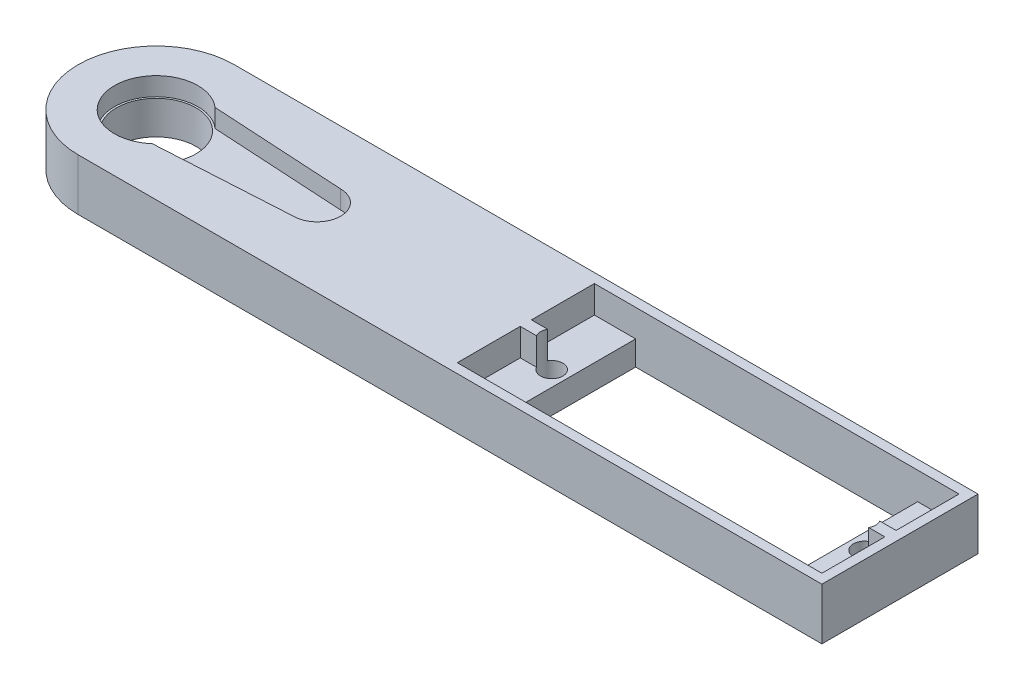
ISO-10303-21;
HEADER;
FILE_DESCRIPTION(('STEP AP214'),'2;1');
FILE_NAME('part.step','',(''),(''),'','','');
FILE_SCHEMA(('AUTOMOTIVE_DESIGN { 1 0 10303 214 1 1 1 1 }'));
ENDSEC;
DATA;
#1=APPLICATION_CONTEXT('core data for automotive mechanical design processes');
#2=APPLICATION_PROTOCOL_DEFINITION('international standard','automotive_design',2000,#1);
#3=PRODUCT_CONTEXT('',#1,'mechanical');
#4=PRODUCT('Part','Part','',(#3));
#5=PRODUCT_RELATED_PRODUCT_CATEGORY('part','',(#4));
#6=PRODUCT_DEFINITION_FORMATION('','',#4);
#7=PRODUCT_DEFINITION_CONTEXT('part definition',#1,'design');
#8=PRODUCT_DEFINITION('design','',#6,#7);
#9=PRODUCT_DEFINITION_SHAPE('','',#8);
#10=(LENGTH_UNIT() NAMED_UNIT(*) SI_UNIT(.MILLI.,.METRE.));
#11=(NAMED_UNIT(*) PLANE_ANGLE_UNIT() SI_UNIT($,.RADIAN.));
#12=(NAMED_UNIT(*) SI_UNIT($,.STERADIAN.) SOLID_ANGLE_UNIT());
#13=UNCERTAINTY_MEASURE_WITH_UNIT(LENGTH_MEASURE(1.E-05),#10,'distance_accuracy_value','');
#14=(GEOMETRIC_REPRESENTATION_CONTEXT(3) GLOBAL_UNCERTAINTY_ASSIGNED_CONTEXT((#13)) GLOBAL_UNIT_ASSIGNED_CONTEXT((#10,
#11,#12)) REPRESENTATION_CONTEXT('',''));
#15=CARTESIAN_POINT('',(0.,0.,0.));
#16=DIRECTION('',(0.,0.,1.));
#17=DIRECTION('',(1.,0.,0.));
#18=AXIS2_PLACEMENT_3D('',#15,#16,#17);
#19=CARTESIAN_POINT('',(36.85,0.,0.));
#20=DIRECTION('',(1.,0.,0.));
#21=DIRECTION('',(0.,0.,-1.));
#22=AXIS2_PLACEMENT_3D('',#19,#20,#21);
#23=PLANE('',#22);
#24=DIRECTION('',(0.,1.,0.));
#25=VECTOR('',#24,1.);
#26=CARTESIAN_POINT('',(36.85,0.,-6.15));
#27=LINE('',#26,#25);
#28=CARTESIAN_POINT('',(36.85,0.,-6.15));
#29=VERTEX_POINT('',#28);
#30=CARTESIAN_POINT('',(36.85,2.19,-6.15));
#31=VERTEX_POINT('',#30);
#32=EDGE_CURVE('E209',#29,#31,#27,.T.);
#33=ORIENTED_EDGE('',*,*,#32,.T.);
#34=DIRECTION('',(0.,0.,-1.));
#35=VECTOR('',#34,1.);
#36=CARTESIAN_POINT('',(36.85,2.19,6.15));
#37=LINE('',#36,#35);
#38=CARTESIAN_POINT('',(36.85,2.19,6.15));
#39=VERTEX_POINT('',#38);
#40=EDGE_CURVE('E217',#39,#31,#37,.T.);
#41=ORIENTED_EDGE('',*,*,#40,.F.);
#42=DIRECTION('',(0.,-1.,0.));
#43=VECTOR('',#42,1.);
#44=CARTESIAN_POINT('',(36.85,3.19,6.15));
#45=LINE('',#44,#43);
#46=CARTESIAN_POINT('',(36.85,0.,6.15));
#47=VERTEX_POINT('',#46);
#48=EDGE_CURVE('E227',#39,#47,#45,.T.);
#49=ORIENTED_EDGE('',*,*,#48,.T.);
#50=DIRECTION('',(0.,0.,-1.));
#51=VECTOR('',#50,1.);
#52=CARTESIAN_POINT('',(36.85,0.,6.15));
#53=LINE('',#52,#51);
#54=EDGE_CURVE('E225',#47,#29,#53,.T.);
#55=ORIENTED_EDGE('',*,*,#54,.T.);
#56=EDGE_LOOP('',(#33,#41,#49,#55));
#57=FACE_BOUND('',#56,.T.);
#58=ADVANCED_FACE('F40',(#57),#23,.T.);
#59=CARTESIAN_POINT('',(62.1396314901945,0.,0.));
#60=DIRECTION('',(-1.,0.,0.));
#61=DIRECTION('',(0.,0.,1.));
#62=AXIS2_PLACEMENT_3D('',#59,#60,#61);
#63=PLANE('',#62);
#64=DIRECTION('',(0.,1.,0.));
#65=VECTOR('',#64,1.);
#66=CARTESIAN_POINT('',(62.1396314901945,0.,6.15));
#67=LINE('',#66,#65);
#68=CARTESIAN_POINT('',(62.1396314901945,0.,6.15));
#69=VERTEX_POINT('',#68);
#70=CARTESIAN_POINT('',(62.1396314901945,2.19,6.15));
#71=VERTEX_POINT('',#70);
#72=EDGE_CURVE('E233',#69,#71,#67,.T.);
#73=ORIENTED_EDGE('',*,*,#72,.T.);
#74=DIRECTION('',(0.,0.,1.));
#75=VECTOR('',#74,1.);
#76=CARTESIAN_POINT('',(62.1396314901945,2.19,-6.15));
#77=LINE('',#76,#75);
#78=CARTESIAN_POINT('',(62.1396314901945,2.19,-6.15));
#79=VERTEX_POINT('',#78);
#80=EDGE_CURVE('E455',#79,#71,#77,.T.);
#81=ORIENTED_EDGE('',*,*,#80,.F.);
#82=DIRECTION('',(0.,-1.,0.));
#83=VECTOR('',#82,1.);
#84=CARTESIAN_POINT('',(62.1396314901945,3.19,-6.15));
#85=LINE('',#84,#83);
#86=CARTESIAN_POINT('',(62.1396314901945,0.,-6.15));
#87=VERTEX_POINT('',#86);
#88=EDGE_CURVE('E228',#79,#87,#85,.T.);
#89=ORIENTED_EDGE('',*,*,#88,.T.);
#90=DIRECTION('',(0.,0.,1.));
#91=VECTOR('',#90,1.);
#92=CARTESIAN_POINT('',(62.1396314901945,0.,-6.15));
#93=LINE('',#92,#91);
#94=EDGE_CURVE('E481',#87,#69,#93,.T.);
#95=ORIENTED_EDGE('',*,*,#94,.T.);
#96=EDGE_LOOP('',(#73,#81,#89,#95));
#97=FACE_BOUND('',#96,.T.);
#98=ADVANCED_FACE('F488',(#97),#63,.T.);
#99=CARTESIAN_POINT('',(0.,4.64,0.));
#100=DIRECTION('',(0.,1.,0.));
#101=DIRECTION('',(0.,0.,1.));
#102=AXIS2_PLACEMENT_3D('',#99,#100,#101);
#103=PLANE('',#102);
#104=DIRECTION('',(0.,0.,-1.));
#105=VECTOR('',#104,1.);
#106=CARTESIAN_POINT('',(65.85,4.64,6.15));
#107=LINE('',#106,#105);
#108=CARTESIAN_POINT('',(65.85,4.64,6.15));
#109=VERTEX_POINT('',#108);
#110=CARTESIAN_POINT('',(65.85,4.64,0.5));
#111=VERTEX_POINT('',#110);
#112=EDGE_CURVE('E240',#109,#111,#107,.T.);
#113=ORIENTED_EDGE('',*,*,#112,.F.);
#114=DIRECTION('',(-1.,0.,0.));
#115=VECTOR('',#114,1.);
#116=CARTESIAN_POINT('',(37.85,4.64,6.15));
#117=LINE('',#116,#115);
#118=CARTESIAN_POINT('',(33.15,4.64,6.15));
#119=VERTEX_POINT('',#118);
#120=EDGE_CURVE('E288',#109,#119,#117,.T.);
#121=ORIENTED_EDGE('',*,*,#120,.T.);
#122=DIRECTION('',(0.,0.,-1.));
#123=VECTOR('',#122,1.);
#124=CARTESIAN_POINT('',(33.15,4.64,6.15));
#125=LINE('',#124,#123);
#126=CARTESIAN_POINT('',(33.15,4.64,0.5));
#127=VERTEX_POINT('',#126);
#128=EDGE_CURVE('E264',#119,#127,#125,.T.);
#129=ORIENTED_EDGE('',*,*,#128,.T.);
#130=DIRECTION('',(-1.,0.,0.));
#131=VECTOR('',#130,1.);
#132=CARTESIAN_POINT('',(0.,4.64,0.500000000000009));
#133=LINE('',#132,#131);
#134=CARTESIAN_POINT('',(34.6056199658342,4.64,0.5));
#135=VERTEX_POINT('',#134);
#136=EDGE_CURVE('E49',#135,#127,#133,.T.);
#137=ORIENTED_EDGE('',*,*,#136,.F.);
#138=CARTESIAN_POINT('',(35.4716453696186,4.64,0.));
#139=DIRECTION('',(0.,1.,0.));
#140=DIRECTION('',(0.,0.,1.));
#141=AXIS2_PLACEMENT_3D('',#138,#139,#140);
#142=CIRCLE('',#141,1.00000000000001);
#143=CARTESIAN_POINT('',(34.6056199658342,4.64,-0.5));
#144=VERTEX_POINT('',#143);
#145=EDGE_CURVE('E297',#144,#135,#142,.T.);
#146=ORIENTED_EDGE('',*,*,#145,.F.);
#147=DIRECTION('',(-1.,0.,0.));
#148=VECTOR('',#147,1.);
#149=CARTESIAN_POINT('',(0.,4.64,-0.500000000000008));
#150=LINE('',#149,#148);
#151=CARTESIAN_POINT('',(33.15,4.64,-0.5));
#152=VERTEX_POINT('',#151);
#153=EDGE_CURVE('E345',#144,#152,#150,.T.);
#154=ORIENTED_EDGE('',*,*,#153,.T.);
#155=DIRECTION('',(0.,0.,-1.));
#156=VECTOR('',#155,1.);
#157=CARTESIAN_POINT('',(33.15,4.64,-0.5));
#158=LINE('',#157,#156);
#159=CARTESIAN_POINT('',(33.15,4.64,-6.15));
#160=VERTEX_POINT('',#159);
#161=EDGE_CURVE('E250',#152,#160,#158,.T.);
#162=ORIENTED_EDGE('',*,*,#161,.T.);
#163=DIRECTION('',(1.,0.,0.));
#164=VECTOR('',#163,1.);
#165=CARTESIAN_POINT('',(37.85,4.64,-6.15));
#166=LINE('',#165,#164);
#167=CARTESIAN_POINT('',(65.85,4.64,-6.15));
#168=VERTEX_POINT('',#167);
#169=EDGE_CURVE('E273',#160,#168,#166,.T.);
#170=ORIENTED_EDGE('',*,*,#169,.T.);
#171=DIRECTION('',(0.,0.,-1.));
#172=VECTOR('',#171,1.);
#173=CARTESIAN_POINT('',(65.85,4.64,-6.15));
#174=LINE('',#173,#172);
#175=CARTESIAN_POINT('',(65.85,4.64,-0.5));
#176=VERTEX_POINT('',#175);
#177=EDGE_CURVE('E239',#176,#168,#174,.T.);
#178=ORIENTED_EDGE('',*,*,#177,.F.);
#179=DIRECTION('',(-1.,0.,0.));
#180=VECTOR('',#179,1.);
#181=CARTESIAN_POINT('',(0.,4.64,-0.499999999999984));
#182=LINE('',#181,#180);
#183=CARTESIAN_POINT('',(64.3943800341658,4.64,-0.5));
#184=VERTEX_POINT('',#183);
#185=EDGE_CURVE('E312',#176,#184,#182,.T.);
#186=ORIENTED_EDGE('',*,*,#185,.T.);
#187=CARTESIAN_POINT('',(63.5283546303813,4.64,0.));
#188=DIRECTION('',(0.,1.,0.));
#189=DIRECTION('',(0.,0.,1.));
#190=AXIS2_PLACEMENT_3D('',#187,#188,#189);
#191=CIRCLE('',#190,1.00000000000001);
#192=CARTESIAN_POINT('',(64.3943800341658,4.64,0.5));
#193=VERTEX_POINT('',#192);
#194=EDGE_CURVE('E298',#193,#184,#191,.T.);
#195=ORIENTED_EDGE('',*,*,#194,.F.);
#196=DIRECTION('',(1.,0.,0.));
#197=VECTOR('',#196,1.);
#198=CARTESIAN_POINT('',(0.,4.64,0.499999999999984));
#199=LINE('',#198,#197);
#200=EDGE_CURVE('E317',#193,#111,#199,.T.);
#201=ORIENTED_EDGE('',*,*,#200,.T.);
#202=EDGE_LOOP('',(#113,#121,#129,#137,#146,#154,#162,#170,#178,#186,#195,#201));
#203=FACE_BOUND('',#202,.T.);
#204=DIRECTION('',(1.,0.,0.));
#205=VECTOR('',#204,1.);
#206=CARTESIAN_POINT('',(0.,4.64,7.));
#207=LINE('',#206,#205);
#208=CARTESIAN_POINT('',(0.,4.64,7.));
#209=VERTEX_POINT('',#208);
#210=CARTESIAN_POINT('',(66.7,4.64,7.));
#211=VERTEX_POINT('',#210);
#212=EDGE_CURVE('E379',#209,#211,#207,.T.);
#213=ORIENTED_EDGE('',*,*,#212,.T.);
#214=DIRECTION('',(0.,0.,-1.));
#215=VECTOR('',#214,1.);
#216=CARTESIAN_POINT('',(66.7,4.64,0.));
#217=LINE('',#216,#215);
#218=CARTESIAN_POINT('',(66.7,4.64,-7.));
#219=VERTEX_POINT('',#218);
#220=EDGE_CURVE('E320',#211,#219,#217,.T.);
#221=ORIENTED_EDGE('',*,*,#220,.T.);
#222=DIRECTION('',(-1.,0.,0.));
#223=VECTOR('',#222,1.);
#224=CARTESIAN_POINT('',(55.,4.64,-7.));
#225=LINE('',#224,#223);
#226=CARTESIAN_POINT('',(0.,4.64,-7.));
#227=VERTEX_POINT('',#226);
#228=EDGE_CURVE('E348',#219,#227,#225,.T.);
#229=ORIENTED_EDGE('',*,*,#228,.T.);
#230=CARTESIAN_POINT('',(0.,4.64,0.));
#231=DIRECTION('',(0.,1.,0.));
#232=DIRECTION('',(0.,0.,1.));
#233=AXIS2_PLACEMENT_3D('',#230,#231,#232);
#234=CIRCLE('',#233,7.);
#235=EDGE_CURVE('E378',#227,#209,#234,.T.);
#236=ORIENTED_EDGE('',*,*,#235,.T.);
#237=EDGE_LOOP('',(#213,#221,#229,#236));
#238=FACE_BOUND('',#237,.T.);
#239=DIRECTION('',(-0.998310081629833,0.,-0.0581117967045882));
#240=VECTOR('',#239,1.);
#241=CARTESIAN_POINT('',(14.4300468804628,4.64,-2.1199939926796));
#242=LINE('',#241,#240);
#243=CARTESIAN_POINT('',(14.4300468804628,4.64,-2.1199939926796));
#244=VERTEX_POINT('',#243);
#245=CARTESIAN_POINT('',(2.46852452254572,4.64,-2.81627620832731));
#246=VERTEX_POINT('',#245);
#247=EDGE_CURVE('E390',#244,#246,#242,.T.);
#248=ORIENTED_EDGE('',*,*,#247,.F.);
#249=CARTESIAN_POINT('',(14.425,4.64,0.));
#250=DIRECTION('',(0.,1.,0.));
#251=DIRECTION('',(0.,0.,1.));
#252=AXIS2_PLACEMENT_3D('',#249,#250,#251);
#253=CIRCLE('',#252,2.12);
#254=CARTESIAN_POINT('',(14.4300468804629,4.64,2.1199939926796));
#255=VERTEX_POINT('',#254);
#256=EDGE_CURVE('E382',#255,#244,#253,.T.);
#257=ORIENTED_EDGE('',*,*,#256,.F.);
#258=DIRECTION('',(0.998310081629833,0.,-0.0581117967045877));
#259=VECTOR('',#258,1.);
#260=CARTESIAN_POINT('',(2.46852452254572,4.64,2.81627620832731));
#261=LINE('',#260,#259);
#262=CARTESIAN_POINT('',(2.46852452254572,4.64,2.81627620832731));
#263=VERTEX_POINT('',#262);
#264=EDGE_CURVE('E398',#263,#255,#261,.T.);
#265=ORIENTED_EDGE('',*,*,#264,.F.);
#266=CARTESIAN_POINT('',(0.,4.64,0.));
#267=DIRECTION('',(0.,1.,0.));
#268=DIRECTION('',(0.,0.,-1.));
#269=AXIS2_PLACEMENT_3D('',#266,#267,#268);
#270=CIRCLE('',#269,3.745);
#271=EDGE_CURVE('E394',#246,#263,#270,.T.);
#272=ORIENTED_EDGE('',*,*,#271,.F.);
#273=EDGE_LOOP('',(#248,#257,#265,#272));
#274=FACE_BOUND('',#273,.T.);
#275=ADVANCED_FACE('F513',(#203,#238,#274),#103,.T.);
#276=CARTESIAN_POINT('',(0.,3.,0.));
#277=DIRECTION('',(0.,1.,0.));
#278=DIRECTION('',(0.,0.,1.));
#279=AXIS2_PLACEMENT_3D('',#276,#277,#278);
#280=PLANE('',#279);
#281=CARTESIAN_POINT('',(0.,3.,0.));
#282=DIRECTION('',(0.,1.,0.));
#283=DIRECTION('',(0.,0.,1.));
#284=AXIS2_PLACEMENT_3D('',#281,#282,#283);
#285=CIRCLE('',#284,3.575);
#286=CARTESIAN_POINT('',(0.,3.,3.575));
#287=VERTEX_POINT('',#286);
#288=EDGE_CURVE('E363',#287,#287,#285,.T.);
#289=ORIENTED_EDGE('',*,*,#288,.F.);
#290=EDGE_LOOP('',(#289));
#291=FACE_BOUND('',#290,.T.);
#292=DIRECTION('',(0.998310081629833,0.,-0.0581117967045877));
#293=VECTOR('',#292,1.);
#294=CARTESIAN_POINT('',(2.46852452254572,3.,2.81627620832731));
#295=LINE('',#294,#293);
#296=CARTESIAN_POINT('',(2.46852452254572,3.,2.81627620832731));
#297=VERTEX_POINT('',#296);
#298=CARTESIAN_POINT('',(14.4300468804629,3.,2.1199939926796));
#299=VERTEX_POINT('',#298);
#300=EDGE_CURVE('E330',#297,#299,#295,.T.);
#301=ORIENTED_EDGE('',*,*,#300,.T.);
#302=CARTESIAN_POINT('',(14.425,3.,0.));
#303=DIRECTION('',(0.,1.,0.));
#304=DIRECTION('',(0.,0.,1.));
#305=AXIS2_PLACEMENT_3D('',#302,#303,#304);
#306=CIRCLE('',#305,2.12);
#307=CARTESIAN_POINT('',(14.4300468804628,3.,-2.1199939926796));
#308=VERTEX_POINT('',#307);
#309=EDGE_CURVE('E405',#299,#308,#306,.T.);
#310=ORIENTED_EDGE('',*,*,#309,.T.);
#311=DIRECTION('',(-0.998310081629833,0.,-0.0581117967045882));
#312=VECTOR('',#311,1.);
#313=CARTESIAN_POINT('',(14.4300468804628,3.,-2.1199939926796));
#314=LINE('',#313,#312);
#315=CARTESIAN_POINT('',(2.46852452254572,3.,-2.81627620832731));
#316=VERTEX_POINT('',#315);
#317=EDGE_CURVE('E409',#308,#316,#314,.T.);
#318=ORIENTED_EDGE('',*,*,#317,.T.);
#319=CARTESIAN_POINT('',(0.,3.,0.));
#320=DIRECTION('',(0.,1.,0.));
#321=DIRECTION('',(0.,0.,-1.));
#322=AXIS2_PLACEMENT_3D('',#319,#320,#321);
#323=CIRCLE('',#322,3.745);
#324=EDGE_CURVE('E369',#316,#297,#323,.T.);
#325=ORIENTED_EDGE('',*,*,#324,.T.);
#326=EDGE_LOOP('',(#301,#310,#318,#325));
#327=FACE_BOUND('',#326,.T.);
#328=ADVANCED_FACE('F553',(#291,#327),#280,.T.);
#329=CARTESIAN_POINT('',(0.,3.,0.));
#330=DIRECTION('',(0.,-1.,0.));
#331=DIRECTION('',(0.,0.,-1.));
#332=AXIS2_PLACEMENT_3D('',#329,#330,#331);
#333=CYLINDRICAL_SURFACE('',#332,7.);
#334=CARTESIAN_POINT('',(0.,0.,0.));
#335=DIRECTION('',(0.,1.,0.));
#336=DIRECTION('',(0.,0.,1.));
#337=AXIS2_PLACEMENT_3D('',#334,#335,#336);
#338=CIRCLE('',#337,7.);
#339=CARTESIAN_POINT('',(0.,0.,-7.));
#340=VERTEX_POINT('',#339);
#341=CARTESIAN_POINT('',(0.,0.,7.));
#342=VERTEX_POINT('',#341);
#343=EDGE_CURVE('E360',#340,#342,#338,.T.);
#344=ORIENTED_EDGE('',*,*,#343,.T.);
#345=DIRECTION('',(0.,-1.,0.));
#346=VECTOR('',#345,1.);
#347=CARTESIAN_POINT('',(0.,3.,7.));
#348=LINE('',#347,#346);
#349=EDGE_CURVE('E350',#209,#342,#348,.T.);
#350=ORIENTED_EDGE('',*,*,#349,.F.);
#351=ORIENTED_EDGE('',*,*,#235,.F.);
#352=DIRECTION('',(0.,-1.,0.));
#353=VECTOR('',#352,1.);
#354=CARTESIAN_POINT('',(0.,3.,-7.));
#355=LINE('',#354,#353);
#356=EDGE_CURVE('E356',#227,#340,#355,.T.);
#357=ORIENTED_EDGE('',*,*,#356,.T.);
#358=EDGE_LOOP('',(#344,#350,#351,#357));
#359=FACE_BOUND('',#358,.T.);
#360=ADVANCED_FACE('F549',(#359),#333,.T.);
#361=CARTESIAN_POINT('',(0.,3.,7.));
#362=DIRECTION('',(0.,0.,-1.));
#363=DIRECTION('',(-1.,0.,0.));
#364=AXIS2_PLACEMENT_3D('',#361,#362,#363);
#365=PLANE('',#364);
#366=DIRECTION('',(1.,0.,0.));
#367=VECTOR('',#366,1.);
#368=CARTESIAN_POINT('',(0.,0.,7.));
#369=LINE('',#368,#367);
#370=CARTESIAN_POINT('',(66.7,0.,7.));
#371=VERTEX_POINT('',#370);
#372=EDGE_CURVE('E355',#342,#371,#369,.T.);
#373=ORIENTED_EDGE('',*,*,#372,.T.);
#374=DIRECTION('',(0.,1.,0.));
#375=VECTOR('',#374,1.);
#376=CARTESIAN_POINT('',(66.7,-36.2154663092994,7.));
#377=LINE('',#376,#375);
#378=EDGE_CURVE('E331',#371,#211,#377,.T.);
#379=ORIENTED_EDGE('',*,*,#378,.T.);
#380=ORIENTED_EDGE('',*,*,#212,.F.);
#381=ORIENTED_EDGE('',*,*,#349,.T.);
#382=EDGE_LOOP('',(#373,#379,#380,#381));
#383=FACE_BOUND('',#382,.T.);
#384=ADVANCED_FACE('F552',(#383),#365,.F.);
#385=CARTESIAN_POINT('',(0.,3.,-7.));
#386=DIRECTION('',(0.,0.,1.));
#387=DIRECTION('',(1.,0.,0.));
#388=AXIS2_PLACEMENT_3D('',#385,#386,#387);
#389=PLANE('',#388);
#390=ORIENTED_EDGE('',*,*,#356,.F.);
#391=ORIENTED_EDGE('',*,*,#228,.F.);
#392=DIRECTION('',(0.,1.,0.));
#393=VECTOR('',#392,1.);
#394=CARTESIAN_POINT('',(66.7,-36.2154663092994,-7.));
#395=LINE('',#394,#393);
#396=CARTESIAN_POINT('',(66.7,0.,-7.));
#397=VERTEX_POINT('',#396);
#398=EDGE_CURVE('E335',#397,#219,#395,.T.);
#399=ORIENTED_EDGE('',*,*,#398,.F.);
#400=DIRECTION('',(-1.,0.,0.));
#401=VECTOR('',#400,1.);
#402=CARTESIAN_POINT('',(0.,0.,-7.));
#403=LINE('',#402,#401);
#404=EDGE_CURVE('E354',#397,#340,#403,.T.);
#405=ORIENTED_EDGE('',*,*,#404,.T.);
#406=EDGE_LOOP('',(#390,#391,#399,#405));
#407=FACE_BOUND('',#406,.T.);
#408=ADVANCED_FACE('F557',(#407),#389,.F.);
#409=CARTESIAN_POINT('',(0.,0.,0.));
#410=DIRECTION('',(0.,1.,0.));
#411=DIRECTION('',(0.,0.,1.));
#412=AXIS2_PLACEMENT_3D('',#409,#410,#411);
#413=PLANE('',#412);
#414=ORIENTED_EDGE('',*,*,#94,.F.);
#415=DIRECTION('',(-1.,0.,0.));
#416=VECTOR('',#415,1.);
#417=CARTESIAN_POINT('',(0.,0.,-6.15));
#418=LINE('',#417,#416);
#419=EDGE_CURVE('E294',#87,#29,#418,.T.);
#420=ORIENTED_EDGE('',*,*,#419,.T.);
#421=ORIENTED_EDGE('',*,*,#54,.F.);
#422=DIRECTION('',(1.,0.,0.));
#423=VECTOR('',#422,1.);
#424=CARTESIAN_POINT('',(0.,0.,6.15));
#425=LINE('',#424,#423);
#426=EDGE_CURVE('E291',#47,#69,#425,.T.);
#427=ORIENTED_EDGE('',*,*,#426,.T.);
#428=EDGE_LOOP('',(#414,#420,#421,#427));
#429=FACE_BOUND('',#428,.T.);
#430=CARTESIAN_POINT('',(63.5283546303813,0.,0.));
#431=DIRECTION('',(0.,1.,0.));
#432=DIRECTION('',(0.,0.,1.));
#433=AXIS2_PLACEMENT_3D('',#430,#431,#432);
#434=CIRCLE('',#433,1.00000000000001);
#435=CARTESIAN_POINT('',(63.5283546303813,0.,1.00000000000001));
#436=VERTEX_POINT('',#435);
#437=EDGE_CURVE('E301',#436,#436,#434,.F.);
#438=ORIENTED_EDGE('',*,*,#437,.F.);
#439=EDGE_LOOP('',(#438));
#440=FACE_BOUND('',#439,.T.);
#441=CARTESIAN_POINT('',(35.4716453696186,0.,0.));
#442=DIRECTION('',(0.,1.,0.));
#443=DIRECTION('',(0.,0.,1.));
#444=AXIS2_PLACEMENT_3D('',#441,#442,#443);
#445=CIRCLE('',#444,1.00000000000001);
#446=CARTESIAN_POINT('',(35.4716453696186,0.,1.00000000000001));
#447=VERTEX_POINT('',#446);
#448=EDGE_CURVE('E302',#447,#447,#445,.F.);
#449=ORIENTED_EDGE('',*,*,#448,.F.);
#450=EDGE_LOOP('',(#449));
#451=FACE_BOUND('',#450,.T.);
#452=DIRECTION('',(0.,0.,1.));
#453=VECTOR('',#452,1.);
#454=CARTESIAN_POINT('',(66.7,0.,0.));
#455=LINE('',#454,#453);
#456=EDGE_CURVE('E326',#397,#371,#455,.T.);
#457=ORIENTED_EDGE('',*,*,#456,.T.);
#458=ORIENTED_EDGE('',*,*,#372,.F.);
#459=ORIENTED_EDGE('',*,*,#343,.F.);
#460=ORIENTED_EDGE('',*,*,#404,.F.);
#461=EDGE_LOOP('',(#457,#458,#459,#460));
#462=FACE_BOUND('',#461,.T.);
#463=CARTESIAN_POINT('',(0.,0.,0.));
#464=DIRECTION('',(0.,-1.,0.));
#465=DIRECTION('',(0.,0.,-1.));
#466=AXIS2_PLACEMENT_3D('',#463,#464,#465);
#467=CIRCLE('',#466,3.575);
#468=CARTESIAN_POINT('',(0.,0.,-3.575));
#469=VERTEX_POINT('',#468);
#470=EDGE_CURVE('E349',#469,#469,#467,.T.);
#471=ORIENTED_EDGE('',*,*,#470,.F.);
#472=EDGE_LOOP('',(#471));
#473=FACE_BOUND('',#472,.T.);
#474=ADVANCED_FACE('F42',(#429,#440,#451,#462,#473),#413,.F.);
#475=CARTESIAN_POINT('',(0.,3.95,0.));
#476=DIRECTION('',(0.,-1.,0.));
#477=DIRECTION('',(0.,0.,-1.));
#478=AXIS2_PLACEMENT_3D('',#475,#476,#477);
#479=CYLINDRICAL_SURFACE('',#478,3.575);
#480=ORIENTED_EDGE('',*,*,#288,.T.);
#481=EDGE_LOOP('',(#480));
#482=FACE_BOUND('',#481,.T.);
#483=ORIENTED_EDGE('',*,*,#470,.T.);
#484=EDGE_LOOP('',(#483));
#485=FACE_BOUND('',#484,.T.);
#486=ADVANCED_FACE('F565',(#482,#485),#479,.F.);
#487=CARTESIAN_POINT('',(14.425,4.64,0.));
#488=DIRECTION('',(0.,-1.,0.));
#489=DIRECTION('',(0.,0.,-1.));
#490=AXIS2_PLACEMENT_3D('',#487,#488,#489);
#491=CYLINDRICAL_SURFACE('',#490,2.12);
#492=ORIENTED_EDGE('',*,*,#309,.F.);
#493=DIRECTION('',(0.,-1.,0.));
#494=VECTOR('',#493,1.);
#495=CARTESIAN_POINT('',(14.4300468804629,4.64,2.1199939926796));
#496=LINE('',#495,#494);
#497=EDGE_CURVE('E399',#255,#299,#496,.T.);
#498=ORIENTED_EDGE('',*,*,#497,.F.);
#499=ORIENTED_EDGE('',*,*,#256,.T.);
#500=DIRECTION('',(0.,-1.,0.));
#501=VECTOR('',#500,1.);
#502=CARTESIAN_POINT('',(14.4300468804628,4.64,-2.1199939926796));
#503=LINE('',#502,#501);
#504=EDGE_CURVE('E386',#244,#308,#503,.T.);
#505=ORIENTED_EDGE('',*,*,#504,.T.);
#506=EDGE_LOOP('',(#492,#498,#499,#505));
#507=FACE_BOUND('',#506,.T.);
#508=ADVANCED_FACE('F568',(#507),#491,.F.);
#509=CARTESIAN_POINT('',(14.4300468804628,4.64,-2.1199939926796));
#510=DIRECTION('',(-0.0581117967045882,0.,0.998310081629833));
#511=DIRECTION('',(0.998310081629833,0.,0.0581117967045882));
#512=AXIS2_PLACEMENT_3D('',#509,#510,#511);
#513=PLANE('',#512);
#514=ORIENTED_EDGE('',*,*,#317,.F.);
#515=ORIENTED_EDGE('',*,*,#504,.F.);
#516=ORIENTED_EDGE('',*,*,#247,.T.);
#517=DIRECTION('',(0.,-1.,0.));
#518=VECTOR('',#517,1.);
#519=CARTESIAN_POINT('',(2.46852452254572,4.64,-2.81627620832731));
#520=LINE('',#519,#518);
#521=EDGE_CURVE('E391',#246,#316,#520,.T.);
#522=ORIENTED_EDGE('',*,*,#521,.T.);
#523=EDGE_LOOP('',(#514,#515,#516,#522));
#524=FACE_BOUND('',#523,.T.);
#525=ADVANCED_FACE('F575',(#524),#513,.T.);
#526=CARTESIAN_POINT('',(0.,4.64,0.));
#527=DIRECTION('',(0.,-1.,0.));
#528=DIRECTION('',(0.,0.,-1.));
#529=AXIS2_PLACEMENT_3D('',#526,#527,#528);
#530=CYLINDRICAL_SURFACE('',#529,3.745);
#531=ORIENTED_EDGE('',*,*,#324,.F.);
#532=ORIENTED_EDGE('',*,*,#521,.F.);
#533=ORIENTED_EDGE('',*,*,#271,.T.);
#534=DIRECTION('',(0.,-1.,0.));
#535=VECTOR('',#534,1.);
#536=CARTESIAN_POINT('',(2.46852452254572,4.64,2.81627620832731));
#537=LINE('',#536,#535);
#538=EDGE_CURVE('E395',#263,#297,#537,.T.);
#539=ORIENTED_EDGE('',*,*,#538,.T.);
#540=EDGE_LOOP('',(#531,#532,#533,#539));
#541=FACE_BOUND('',#540,.T.);
#542=ADVANCED_FACE('F579',(#541),#530,.F.);
#543=CARTESIAN_POINT('',(2.46852452254572,4.64,2.81627620832731));
#544=DIRECTION('',(-0.0581117967045877,0.,-0.998310081629833));
#545=DIRECTION('',(-0.998310081629834,0.,0.0581117967045878));
#546=AXIS2_PLACEMENT_3D('',#543,#544,#545);
#547=PLANE('',#546);
#548=ORIENTED_EDGE('',*,*,#300,.F.);
#549=ORIENTED_EDGE('',*,*,#538,.F.);
#550=ORIENTED_EDGE('',*,*,#264,.T.);
#551=ORIENTED_EDGE('',*,*,#497,.T.);
#552=EDGE_LOOP('',(#548,#549,#550,#551));
#553=FACE_BOUND('',#552,.T.);
#554=ADVANCED_FACE('F583',(#553),#547,.T.);
#555=CARTESIAN_POINT('',(49.5,5.59,-0.499999999999996));
#556=DIRECTION('',(0.,0.,-1.));
#557=DIRECTION('',(1.,0.,0.));
#558=AXIS2_PLACEMENT_3D('',#555,#556,#557);
#559=PLANE('',#558);
#560=DIRECTION('',(0.,-1.,0.));
#561=VECTOR('',#560,1.);
#562=CARTESIAN_POINT('',(34.6056199658342,5.59,-0.5));
#563=LINE('',#562,#561);
#564=CARTESIAN_POINT('',(34.6056199658342,2.19,-0.500000000000001));
#565=VERTEX_POINT('',#564);
#566=EDGE_CURVE('E344',#144,#565,#563,.T.);
#567=ORIENTED_EDGE('',*,*,#566,.T.);
#568=DIRECTION('',(1.,0.,0.));
#569=VECTOR('',#568,1.);
#570=CARTESIAN_POINT('',(33.15,2.19,-0.5));
#571=LINE('',#570,#569);
#572=CARTESIAN_POINT('',(33.15,2.19,-0.5));
#573=VERTEX_POINT('',#572);
#574=EDGE_CURVE('E430',#573,#565,#571,.T.);
#575=ORIENTED_EDGE('',*,*,#574,.F.);
#576=DIRECTION('',(0.,1.,0.));
#577=VECTOR('',#576,1.);
#578=CARTESIAN_POINT('',(33.15,-4.15931969640728,-0.5));
#579=LINE('',#578,#577);
#580=EDGE_CURVE('E279',#573,#152,#579,.T.);
#581=ORIENTED_EDGE('',*,*,#580,.T.);
#582=ORIENTED_EDGE('',*,*,#153,.F.);
#583=EDGE_LOOP('',(#567,#575,#581,#582));
#584=FACE_BOUND('',#583,.T.);
#585=ADVANCED_FACE('F429',(#584),#559,.T.);
#586=CARTESIAN_POINT('',(49.5,5.59,0.499999999999996));
#587=DIRECTION('',(0.,0.,-1.));
#588=DIRECTION('',(1.,0.,0.));
#589=AXIS2_PLACEMENT_3D('',#586,#587,#588);
#590=PLANE('',#589);
#591=ORIENTED_EDGE('',*,*,#136,.T.);
#592=DIRECTION('',(0.,1.,0.));
#593=VECTOR('',#592,1.);
#594=CARTESIAN_POINT('',(33.15,-4.15931969640728,0.5));
#595=LINE('',#594,#593);
#596=CARTESIAN_POINT('',(33.15,2.19,0.5));
#597=VERTEX_POINT('',#596);
#598=EDGE_CURVE('E268',#597,#127,#595,.T.);
#599=ORIENTED_EDGE('',*,*,#598,.F.);
#600=DIRECTION('',(-1.,0.,0.));
#601=VECTOR('',#600,1.);
#602=CARTESIAN_POINT('',(34.6056199658342,2.19,0.5));
#603=LINE('',#602,#601);
#604=CARTESIAN_POINT('',(34.6056199658342,2.19,0.5));
#605=VERTEX_POINT('',#604);
#606=EDGE_CURVE('E444',#605,#597,#603,.T.);
#607=ORIENTED_EDGE('',*,*,#606,.F.);
#608=DIRECTION('',(0.,-1.,0.));
#609=VECTOR('',#608,1.);
#610=CARTESIAN_POINT('',(34.6056199658342,5.59,0.5));
#611=LINE('',#610,#609);
#612=EDGE_CURVE('E11',#135,#605,#611,.T.);
#613=ORIENTED_EDGE('',*,*,#612,.F.);
#614=EDGE_LOOP('',(#591,#599,#607,#613));
#615=FACE_BOUND('',#614,.T.);
#616=ADVANCED_FACE('F547',(#615),#590,.F.);
#617=CARTESIAN_POINT('',(66.7,-36.2154663092994,0.));
#618=DIRECTION('',(1.,0.,0.));
#619=DIRECTION('',(0.,0.,-1.));
#620=AXIS2_PLACEMENT_3D('',#617,#618,#619);
#621=PLANE('',#620);
#622=ORIENTED_EDGE('',*,*,#456,.F.);
#623=ORIENTED_EDGE('',*,*,#398,.T.);
#624=ORIENTED_EDGE('',*,*,#220,.F.);
#625=ORIENTED_EDGE('',*,*,#378,.F.);
#626=EDGE_LOOP('',(#622,#623,#624,#625));
#627=FACE_BOUND('',#626,.T.);
#628=ADVANCED_FACE('F543',(#627),#621,.T.);
#629=CARTESIAN_POINT('',(0.,-9.69759093081403,-0.499999999999984));
#630=DIRECTION('',(0.,0.,-1.));
#631=DIRECTION('',(-1.,0.,0.));
#632=AXIS2_PLACEMENT_3D('',#629,#630,#631);
#633=PLANE('',#632);
#634=DIRECTION('',(0.,1.,0.));
#635=VECTOR('',#634,1.);
#636=CARTESIAN_POINT('',(65.85,-4.16595483252629,-0.5));
#637=LINE('',#636,#635);
#638=CARTESIAN_POINT('',(65.85,2.19,-0.5));
#639=VERTEX_POINT('',#638);
#640=EDGE_CURVE('E257',#639,#176,#637,.T.);
#641=ORIENTED_EDGE('',*,*,#640,.F.);
#642=DIRECTION('',(1.,0.,0.));
#643=VECTOR('',#642,1.);
#644=CARTESIAN_POINT('',(64.3943800341658,2.19,-0.499999999999996));
#645=LINE('',#644,#643);
#646=CARTESIAN_POINT('',(64.3943800341658,2.19,-0.499999999999991));
#647=VERTEX_POINT('',#646);
#648=EDGE_CURVE('E474',#647,#639,#645,.T.);
#649=ORIENTED_EDGE('',*,*,#648,.F.);
#650=DIRECTION('',(0.,1.,0.));
#651=VECTOR('',#650,1.);
#652=CARTESIAN_POINT('',(64.3943800341658,-9.69759093081403,-0.5));
#653=LINE('',#652,#651);
#654=EDGE_CURVE('E306',#647,#184,#653,.T.);
#655=ORIENTED_EDGE('',*,*,#654,.T.);
#656=ORIENTED_EDGE('',*,*,#185,.F.);
#657=EDGE_LOOP('',(#641,#649,#655,#656));
#658=FACE_BOUND('',#657,.T.);
#659=ADVANCED_FACE('F539',(#658),#633,.T.);
#660=CARTESIAN_POINT('',(0.,-9.69759093081403,0.499999999999984));
#661=DIRECTION('',(0.,0.,1.));
#662=DIRECTION('',(1.,0.,0.));
#663=AXIS2_PLACEMENT_3D('',#660,#661,#662);
#664=PLANE('',#663);
#665=DIRECTION('',(0.,1.,0.));
#666=VECTOR('',#665,1.);
#667=CARTESIAN_POINT('',(64.3943800341658,-9.69759093081403,0.5));
#668=LINE('',#667,#666);
#669=CARTESIAN_POINT('',(64.3943800341658,2.19,0.5));
#670=VERTEX_POINT('',#669);
#671=EDGE_CURVE('E316',#670,#193,#668,.T.);
#672=ORIENTED_EDGE('',*,*,#671,.F.);
#673=DIRECTION('',(-1.,0.,0.));
#674=VECTOR('',#673,1.);
#675=CARTESIAN_POINT('',(65.85,2.19,0.5));
#676=LINE('',#675,#674);
#677=CARTESIAN_POINT('',(65.85,2.19,0.5));
#678=VERTEX_POINT('',#677);
#679=EDGE_CURVE('E466',#678,#670,#676,.T.);
#680=ORIENTED_EDGE('',*,*,#679,.F.);
#681=DIRECTION('',(0.,1.,0.));
#682=VECTOR('',#681,1.);
#683=CARTESIAN_POINT('',(65.85,-4.16595483252629,0.5));
#684=LINE('',#683,#682);
#685=EDGE_CURVE('E246',#678,#111,#684,.T.);
#686=ORIENTED_EDGE('',*,*,#685,.T.);
#687=ORIENTED_EDGE('',*,*,#200,.F.);
#688=EDGE_LOOP('',(#672,#680,#686,#687));
#689=FACE_BOUND('',#688,.T.);
#690=ADVANCED_FACE('F533',(#689),#664,.T.);
#691=CARTESIAN_POINT('',(63.5283546303813,-2.82842712474623,0.));
#692=DIRECTION('',(0.,1.,0.));
#693=DIRECTION('',(0.,0.,1.));
#694=AXIS2_PLACEMENT_3D('',#691,#692,#693);
#695=CYLINDRICAL_SURFACE('',#694,1.00000000000001);
#696=ORIENTED_EDGE('',*,*,#654,.F.);
#697=CARTESIAN_POINT('',(63.5283546303813,2.19,0.));
#698=DIRECTION('',(0.,-1.,0.));
#699=DIRECTION('',(0.,0.,1.));
#700=AXIS2_PLACEMENT_3D('',#697,#698,#699);
#701=CIRCLE('',#700,1.00000000000001);
#702=EDGE_CURVE('E470',#670,#647,#701,.T.);
#703=ORIENTED_EDGE('',*,*,#702,.F.);
#704=ORIENTED_EDGE('',*,*,#671,.T.);
#705=ORIENTED_EDGE('',*,*,#194,.T.);
#706=EDGE_LOOP('',(#696,#703,#704,#705));
#707=FACE_BOUND('',#706,.T.);
#708=ORIENTED_EDGE('',*,*,#437,.T.);
#709=EDGE_LOOP('',(#708));
#710=FACE_BOUND('',#709,.T.);
#711=ADVANCED_FACE('F530',(#707,#710),#695,.F.);
#712=CARTESIAN_POINT('',(35.4716453696186,-2.82842712474623,0.));
#713=DIRECTION('',(0.,1.,0.));
#714=DIRECTION('',(0.,0.,1.));
#715=AXIS2_PLACEMENT_3D('',#712,#713,#714);
#716=CYLINDRICAL_SURFACE('',#715,1.00000000000001);
#717=ORIENTED_EDGE('',*,*,#612,.T.);
#718=CARTESIAN_POINT('',(35.4716453696186,2.19,0.));
#719=DIRECTION('',(0.,-1.,0.));
#720=DIRECTION('',(0.,0.,1.));
#721=AXIS2_PLACEMENT_3D('',#718,#719,#720);
#722=CIRCLE('',#721,1.);
#723=EDGE_CURVE('E436',#565,#605,#722,.T.);
#724=ORIENTED_EDGE('',*,*,#723,.F.);
#725=ORIENTED_EDGE('',*,*,#566,.F.);
#726=ORIENTED_EDGE('',*,*,#145,.T.);
#727=EDGE_LOOP('',(#717,#724,#725,#726));
#728=FACE_BOUND('',#727,.T.);
#729=ORIENTED_EDGE('',*,*,#448,.T.);
#730=EDGE_LOOP('',(#729));
#731=FACE_BOUND('',#730,.T.);
#732=ADVANCED_FACE('F439',(#728,#731),#716,.F.);
#733=CARTESIAN_POINT('',(37.85,4.64,-6.15));
#734=DIRECTION('',(0.,0.,-1.));
#735=DIRECTION('',(-1.,0.,0.));
#736=AXIS2_PLACEMENT_3D('',#733,#734,#735);
#737=PLANE('',#736);
#738=ORIENTED_EDGE('',*,*,#419,.F.);
#739=ORIENTED_EDGE('',*,*,#88,.F.);
#740=DIRECTION('',(-1.,0.,0.));
#741=VECTOR('',#740,1.);
#742=CARTESIAN_POINT('',(65.85,2.19,-6.15));
#743=LINE('',#742,#741);
#744=CARTESIAN_POINT('',(65.85,2.19,-6.15));
#745=VERTEX_POINT('',#744);
#746=EDGE_CURVE('E64',#745,#79,#743,.T.);
#747=ORIENTED_EDGE('',*,*,#746,.F.);
#748=DIRECTION('',(0.,1.,0.));
#749=VECTOR('',#748,1.);
#750=CARTESIAN_POINT('',(65.85,-4.16595483252629,-6.15));
#751=LINE('',#750,#749);
#752=EDGE_CURVE('E245',#745,#168,#751,.T.);
#753=ORIENTED_EDGE('',*,*,#752,.T.);
#754=ORIENTED_EDGE('',*,*,#169,.F.);
#755=DIRECTION('',(0.,1.,0.));
#756=VECTOR('',#755,1.);
#757=CARTESIAN_POINT('',(33.15,-4.15931969640728,-6.15));
#758=LINE('',#757,#756);
#759=CARTESIAN_POINT('',(33.15,2.19,-6.15));
#760=VERTEX_POINT('',#759);
#761=EDGE_CURVE('E212',#760,#160,#758,.T.);
#762=ORIENTED_EDGE('',*,*,#761,.F.);
#763=DIRECTION('',(-1.,0.,0.));
#764=VECTOR('',#763,1.);
#765=CARTESIAN_POINT('',(36.85,2.19,-6.15));
#766=LINE('',#765,#764);
#767=EDGE_CURVE('E205',#31,#760,#766,.T.);
#768=ORIENTED_EDGE('',*,*,#767,.F.);
#769=ORIENTED_EDGE('',*,*,#32,.F.);
#770=EDGE_LOOP('',(#738,#739,#747,#753,#754,#762,#768,#769));
#771=FACE_BOUND('',#770,.T.);
#772=ADVANCED_FACE('F207',(#771),#737,.F.);
#773=CARTESIAN_POINT('',(37.85,4.64,6.15));
#774=DIRECTION('',(0.,0.,1.));
#775=DIRECTION('',(1.,0.,0.));
#776=AXIS2_PLACEMENT_3D('',#773,#774,#775);
#777=PLANE('',#776);
#778=DIRECTION('',(1.,0.,0.));
#779=VECTOR('',#778,1.);
#780=CARTESIAN_POINT('',(33.15,2.19,6.15));
#781=LINE('',#780,#779);
#782=CARTESIAN_POINT('',(33.15,2.19,6.15));
#783=VERTEX_POINT('',#782);
#784=EDGE_CURVE('E56',#783,#39,#781,.T.);
#785=ORIENTED_EDGE('',*,*,#784,.F.);
#786=DIRECTION('',(0.,1.,0.));
#787=VECTOR('',#786,1.);
#788=CARTESIAN_POINT('',(33.15,-4.15931969640728,6.15));
#789=LINE('',#788,#787);
#790=EDGE_CURVE('E269',#783,#119,#789,.T.);
#791=ORIENTED_EDGE('',*,*,#790,.T.);
#792=ORIENTED_EDGE('',*,*,#120,.F.);
#793=DIRECTION('',(0.,1.,0.));
#794=VECTOR('',#793,1.);
#795=CARTESIAN_POINT('',(65.85,-4.16595483252629,6.15));
#796=LINE('',#795,#794);
#797=CARTESIAN_POINT('',(65.85,2.19,6.15));
#798=VERTEX_POINT('',#797);
#799=EDGE_CURVE('E244',#798,#109,#796,.T.);
#800=ORIENTED_EDGE('',*,*,#799,.F.);
#801=DIRECTION('',(1.,0.,0.));
#802=VECTOR('',#801,1.);
#803=CARTESIAN_POINT('',(62.1396314901945,2.19,6.15));
#804=LINE('',#803,#802);
#805=EDGE_CURVE('E458',#71,#798,#804,.T.);
#806=ORIENTED_EDGE('',*,*,#805,.F.);
#807=ORIENTED_EDGE('',*,*,#72,.F.);
#808=ORIENTED_EDGE('',*,*,#426,.F.);
#809=ORIENTED_EDGE('',*,*,#48,.F.);
#810=EDGE_LOOP('',(#785,#791,#792,#800,#806,#807,#808,#809));
#811=FACE_BOUND('',#810,.T.);
#812=ADVANCED_FACE('F493',(#811),#777,.F.);
#813=CARTESIAN_POINT('',(33.15,-4.15931969640728,-0.5));
#814=DIRECTION('',(1.,0.,0.));
#815=DIRECTION('',(0.,0.,-1.));
#816=AXIS2_PLACEMENT_3D('',#813,#814,#815);
#817=PLANE('',#816);
#818=ORIENTED_EDGE('',*,*,#580,.F.);
#819=DIRECTION('',(0.,0.,1.));
#820=VECTOR('',#819,1.);
#821=CARTESIAN_POINT('',(33.15,2.19,-6.15));
#822=LINE('',#821,#820);
#823=EDGE_CURVE('E216',#760,#573,#822,.T.);
#824=ORIENTED_EDGE('',*,*,#823,.F.);
#825=ORIENTED_EDGE('',*,*,#761,.T.);
#826=ORIENTED_EDGE('',*,*,#161,.F.);
#827=EDGE_LOOP('',(#818,#824,#825,#826));
#828=FACE_BOUND('',#827,.T.);
#829=ADVANCED_FACE('F521',(#828),#817,.T.);
#830=CARTESIAN_POINT('',(33.15,-4.15931969640728,6.15));
#831=DIRECTION('',(1.,0.,0.));
#832=DIRECTION('',(0.,0.,-1.));
#833=AXIS2_PLACEMENT_3D('',#830,#831,#832);
#834=PLANE('',#833);
#835=ORIENTED_EDGE('',*,*,#790,.F.);
#836=DIRECTION('',(0.,0.,1.));
#837=VECTOR('',#836,1.);
#838=CARTESIAN_POINT('',(33.15,2.19,0.5));
#839=LINE('',#838,#837);
#840=EDGE_CURVE('E447',#597,#783,#839,.T.);
#841=ORIENTED_EDGE('',*,*,#840,.F.);
#842=ORIENTED_EDGE('',*,*,#598,.T.);
#843=ORIENTED_EDGE('',*,*,#128,.F.);
#844=EDGE_LOOP('',(#835,#841,#842,#843));
#845=FACE_BOUND('',#844,.T.);
#846=ADVANCED_FACE('F517',(#845),#834,.T.);
#847=CARTESIAN_POINT('',(65.85,-4.16595483252629,-6.15));
#848=DIRECTION('',(1.,0.,0.));
#849=DIRECTION('',(0.,0.,-1.));
#850=AXIS2_PLACEMENT_3D('',#847,#848,#849);
#851=PLANE('',#850);
#852=ORIENTED_EDGE('',*,*,#640,.T.);
#853=ORIENTED_EDGE('',*,*,#177,.T.);
#854=ORIENTED_EDGE('',*,*,#752,.F.);
#855=DIRECTION('',(0.,0.,-1.));
#856=VECTOR('',#855,1.);
#857=CARTESIAN_POINT('',(65.85,2.19,-0.5));
#858=LINE('',#857,#856);
#859=EDGE_CURVE('E478',#639,#745,#858,.T.);
#860=ORIENTED_EDGE('',*,*,#859,.F.);
#861=EDGE_LOOP('',(#852,#853,#854,#860));
#862=FACE_BOUND('',#861,.T.);
#863=ADVANCED_FACE('F504',(#862),#851,.F.);
#864=CARTESIAN_POINT('',(65.85,-4.16595483252629,6.15));
#865=DIRECTION('',(1.,0.,0.));
#866=DIRECTION('',(0.,0.,-1.));
#867=AXIS2_PLACEMENT_3D('',#864,#865,#866);
#868=PLANE('',#867);
#869=ORIENTED_EDGE('',*,*,#799,.T.);
#870=ORIENTED_EDGE('',*,*,#112,.T.);
#871=ORIENTED_EDGE('',*,*,#685,.F.);
#872=DIRECTION('',(0.,0.,-1.));
#873=VECTOR('',#872,1.);
#874=CARTESIAN_POINT('',(65.85,2.19,6.15));
#875=LINE('',#874,#873);
#876=EDGE_CURVE('E462',#798,#678,#875,.T.);
#877=ORIENTED_EDGE('',*,*,#876,.F.);
#878=EDGE_LOOP('',(#869,#870,#871,#877));
#879=FACE_BOUND('',#878,.T.);
#880=ADVANCED_FACE('F497',(#879),#868,.F.);
#881=CARTESIAN_POINT('',(63.5283546303813,2.19,0.));
#882=DIRECTION('',(0.,1.,0.));
#883=DIRECTION('',(0.,0.,1.));
#884=AXIS2_PLACEMENT_3D('',#881,#882,#883);
#885=PLANE('',#884);
#886=ORIENTED_EDGE('',*,*,#746,.T.);
#887=ORIENTED_EDGE('',*,*,#80,.T.);
#888=ORIENTED_EDGE('',*,*,#805,.T.);
#889=ORIENTED_EDGE('',*,*,#876,.T.);
#890=ORIENTED_EDGE('',*,*,#679,.T.);
#891=ORIENTED_EDGE('',*,*,#702,.T.);
#892=ORIENTED_EDGE('',*,*,#648,.T.);
#893=ORIENTED_EDGE('',*,*,#859,.T.);
#894=EDGE_LOOP('',(#886,#887,#888,#889,#890,#891,#892,#893));
#895=FACE_BOUND('',#894,.T.);
#896=ADVANCED_FACE('F495',(#895),#885,.T.);
#897=CARTESIAN_POINT('',(35.4716453696186,2.19,0.));
#898=DIRECTION('',(0.,1.,0.));
#899=DIRECTION('',(0.,0.,1.));
#900=AXIS2_PLACEMENT_3D('',#897,#898,#899);
#901=PLANE('',#900);
#902=ORIENTED_EDGE('',*,*,#784,.T.);
#903=ORIENTED_EDGE('',*,*,#40,.T.);
#904=ORIENTED_EDGE('',*,*,#767,.T.);
#905=ORIENTED_EDGE('',*,*,#823,.T.);
#906=ORIENTED_EDGE('',*,*,#574,.T.);
#907=ORIENTED_EDGE('',*,*,#723,.T.);
#908=ORIENTED_EDGE('',*,*,#606,.T.);
#909=ORIENTED_EDGE('',*,*,#840,.T.);
#910=EDGE_LOOP('',(#902,#903,#904,#905,#906,#907,#908,#909));
#911=FACE_BOUND('',#910,.T.);
#912=ADVANCED_FACE('F219',(#911),#901,.T.);
#913=CLOSED_SHELL('',(#58,#98,#275,#328,#360,#384,#408,#474,#486,#508,#525,#542,#554,#585,#616,
#628,#659,#690,#711,#732,#772,#812,#829,#846,#863,#880,#896,#912));
#914=MANIFOLD_SOLID_BREP('B2',#913);
#915=ADVANCED_BREP_SHAPE_REPRESENTATION('',(#18,#914),#14);
#916=SHAPE_DEFINITION_REPRESENTATION(#9,#915);
ENDSEC;
END-ISO-10303-21;
